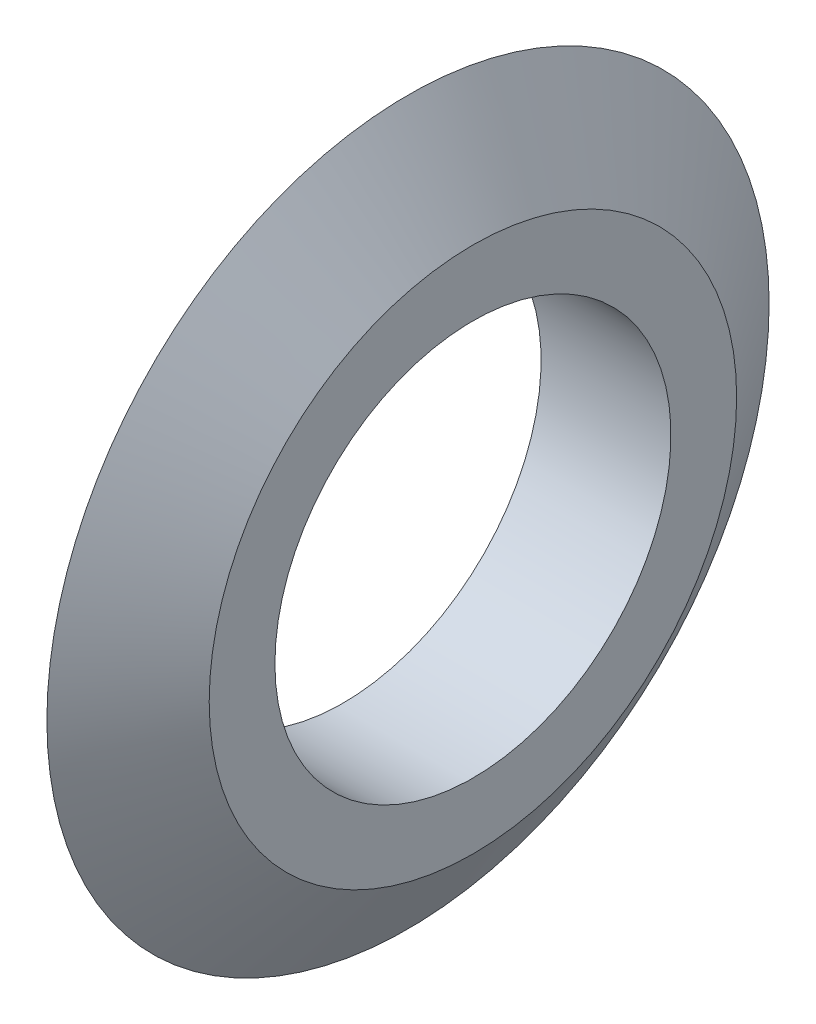
ISO-10303-21;
HEADER;
FILE_DESCRIPTION(('STEP AP214'),'2;1');
FILE_NAME('part.step','',(''),(''),'','','');
FILE_SCHEMA(('AUTOMOTIVE_DESIGN { 1 0 10303 214 1 1 1 1 }'));
ENDSEC;
DATA;
#1=APPLICATION_CONTEXT('core data for automotive mechanical design processes');
#2=APPLICATION_PROTOCOL_DEFINITION('international standard','automotive_design',2000,#1);
#3=PRODUCT_CONTEXT('',#1,'mechanical');
#4=PRODUCT('Part','Part','',(#3));
#5=PRODUCT_RELATED_PRODUCT_CATEGORY('part','',(#4));
#6=PRODUCT_DEFINITION_FORMATION('','',#4);
#7=PRODUCT_DEFINITION_CONTEXT('part definition',#1,'design');
#8=PRODUCT_DEFINITION('design','',#6,#7);
#9=PRODUCT_DEFINITION_SHAPE('','',#8);
#10=(LENGTH_UNIT() NAMED_UNIT(*) SI_UNIT(.MILLI.,.METRE.));
#11=(NAMED_UNIT(*) PLANE_ANGLE_UNIT() SI_UNIT($,.RADIAN.));
#12=(NAMED_UNIT(*) SI_UNIT($,.STERADIAN.) SOLID_ANGLE_UNIT());
#13=UNCERTAINTY_MEASURE_WITH_UNIT(LENGTH_MEASURE(1.E-05),#10,'distance_accuracy_value','');
#14=(GEOMETRIC_REPRESENTATION_CONTEXT(3) GLOBAL_UNCERTAINTY_ASSIGNED_CONTEXT((#13)) GLOBAL_UNIT_ASSIGNED_CONTEXT((#10,
#11,#12)) REPRESENTATION_CONTEXT('',''));
#15=CARTESIAN_POINT('',(0.,0.,0.));
#16=DIRECTION('',(0.,0.,1.));
#17=DIRECTION('',(1.,0.,0.));
#18=AXIS2_PLACEMENT_3D('',#15,#16,#17);
#19=CARTESIAN_POINT('',(2.,0.,0.));
#20=DIRECTION('',(-1.,0.,0.));
#21=DIRECTION('',(0.,0.,1.));
#22=AXIS2_PLACEMENT_3D('',#19,#20,#21);
#23=CONICAL_SURFACE('',#22,8.1243583231508,0.982793723247329);
#24=CARTESIAN_POINT('',(0.,0.,0.));
#25=DIRECTION('',(-1.,0.,0.));
#26=DIRECTION('',(0.,0.,1.));
#27=AXIS2_PLACEMENT_3D('',#24,#25,#26);
#28=CIRCLE('',#27,11.1243583231508);
#29=CARTESIAN_POINT('',(0.,0.,11.1243583231508));
#30=VERTEX_POINT('',#29);
#31=EDGE_CURVE('E49',#30,#30,#28,.T.);
#32=ORIENTED_EDGE('',*,*,#31,.F.);
#33=EDGE_LOOP('',(#32));
#34=FACE_BOUND('',#33,.T.);
#35=CARTESIAN_POINT('',(2.,0.,0.));
#36=DIRECTION('',(-1.,0.,0.));
#37=DIRECTION('',(0.,0.,1.));
#38=AXIS2_PLACEMENT_3D('',#35,#36,#37);
#39=CIRCLE('',#38,8.1243583231508);
#40=CARTESIAN_POINT('',(2.,0.,8.1243583231508));
#41=VERTEX_POINT('',#40);
#42=EDGE_CURVE('E10',#41,#41,#39,.T.);
#43=ORIENTED_EDGE('',*,*,#42,.T.);
#44=EDGE_LOOP('',(#43));
#45=FACE_BOUND('',#44,.T.);
#46=ADVANCED_FACE('F30',(#34,#45),#23,.T.);
#47=CARTESIAN_POINT('',(2.,6.1,0.));
#48=DIRECTION('',(-1.,0.,0.));
#49=DIRECTION('',(0.,0.,1.));
#50=AXIS2_PLACEMENT_3D('',#47,#48,#49);
#51=PLANE('',#50);
#52=ORIENTED_EDGE('',*,*,#42,.F.);
#53=EDGE_LOOP('',(#52));
#54=FACE_BOUND('',#53,.T.);
#55=CARTESIAN_POINT('',(2.,0.,0.));
#56=DIRECTION('',(-1.,0.,0.));
#57=DIRECTION('',(0.,0.,1.));
#58=AXIS2_PLACEMENT_3D('',#55,#56,#57);
#59=CIRCLE('',#58,6.1);
#60=CARTESIAN_POINT('',(2.,0.,6.1));
#61=VERTEX_POINT('',#60);
#62=EDGE_CURVE('E36',#61,#61,#59,.T.);
#63=ORIENTED_EDGE('',*,*,#62,.T.);
#64=EDGE_LOOP('',(#63));
#65=FACE_BOUND('',#64,.T.);
#66=ADVANCED_FACE('F56',(#54,#65),#51,.F.);
#67=CARTESIAN_POINT('',(-6.92407809110628,0.,0.));
#68=DIRECTION('',(-1.,0.,0.));
#69=DIRECTION('',(0.,0.,1.));
#70=AXIS2_PLACEMENT_3D('',#67,#68,#69);
#71=CYLINDRICAL_SURFACE('',#70,6.1);
#72=ORIENTED_EDGE('',*,*,#62,.F.);
#73=EDGE_LOOP('',(#72));
#74=FACE_BOUND('',#73,.T.);
#75=CARTESIAN_POINT('',(-2.,0.,0.));
#76=DIRECTION('',(-1.,0.,0.));
#77=DIRECTION('',(0.,0.,1.));
#78=AXIS2_PLACEMENT_3D('',#75,#76,#77);
#79=CIRCLE('',#78,6.1);
#80=CARTESIAN_POINT('',(-2.,0.,6.1));
#81=VERTEX_POINT('',#80);
#82=EDGE_CURVE('E40',#81,#81,#79,.T.);
#83=ORIENTED_EDGE('',*,*,#82,.T.);
#84=EDGE_LOOP('',(#83));
#85=FACE_BOUND('',#84,.T.);
#86=ADVANCED_FACE('F60',(#74,#85),#71,.F.);
#87=CARTESIAN_POINT('',(-2.,6.1,0.));
#88=DIRECTION('',(1.,0.,0.));
#89=DIRECTION('',(0.,0.,-1.));
#90=AXIS2_PLACEMENT_3D('',#87,#88,#89);
#91=PLANE('',#90);
#92=ORIENTED_EDGE('',*,*,#82,.F.);
#93=EDGE_LOOP('',(#92));
#94=FACE_BOUND('',#93,.T.);
#95=CARTESIAN_POINT('',(-2.,0.,0.));
#96=DIRECTION('',(-1.,0.,0.));
#97=DIRECTION('',(0.,0.,1.));
#98=AXIS2_PLACEMENT_3D('',#95,#96,#97);
#99=CIRCLE('',#98,8.1243583231508);
#100=CARTESIAN_POINT('',(-2.,0.,8.1243583231508));
#101=VERTEX_POINT('',#100);
#102=EDGE_CURVE('E44',#101,#101,#99,.T.);
#103=ORIENTED_EDGE('',*,*,#102,.T.);
#104=EDGE_LOOP('',(#103));
#105=FACE_BOUND('',#104,.T.);
#106=ADVANCED_FACE('F65',(#94,#105),#91,.F.);
#107=CARTESIAN_POINT('',(0.,0.,0.));
#108=DIRECTION('',(1.,0.,0.));
#109=DIRECTION('',(0.,0.,-1.));
#110=AXIS2_PLACEMENT_3D('',#107,#108,#109);
#111=CONICAL_SURFACE('',#110,11.1243583231508,0.982793723247329);
#112=ORIENTED_EDGE('',*,*,#102,.F.);
#113=EDGE_LOOP('',(#112));
#114=FACE_BOUND('',#113,.T.);
#115=ORIENTED_EDGE('',*,*,#31,.T.);
#116=EDGE_LOOP('',(#115));
#117=FACE_BOUND('',#116,.T.);
#118=ADVANCED_FACE('F53',(#114,#117),#111,.T.);
#119=CLOSED_SHELL('',(#46,#66,#86,#106,#118));
#120=MANIFOLD_SOLID_BREP('B2',#119);
#121=ADVANCED_BREP_SHAPE_REPRESENTATION('',(#18,#120),#14);
#122=SHAPE_DEFINITION_REPRESENTATION(#9,#121);
ENDSEC;
END-ISO-10303-21;
